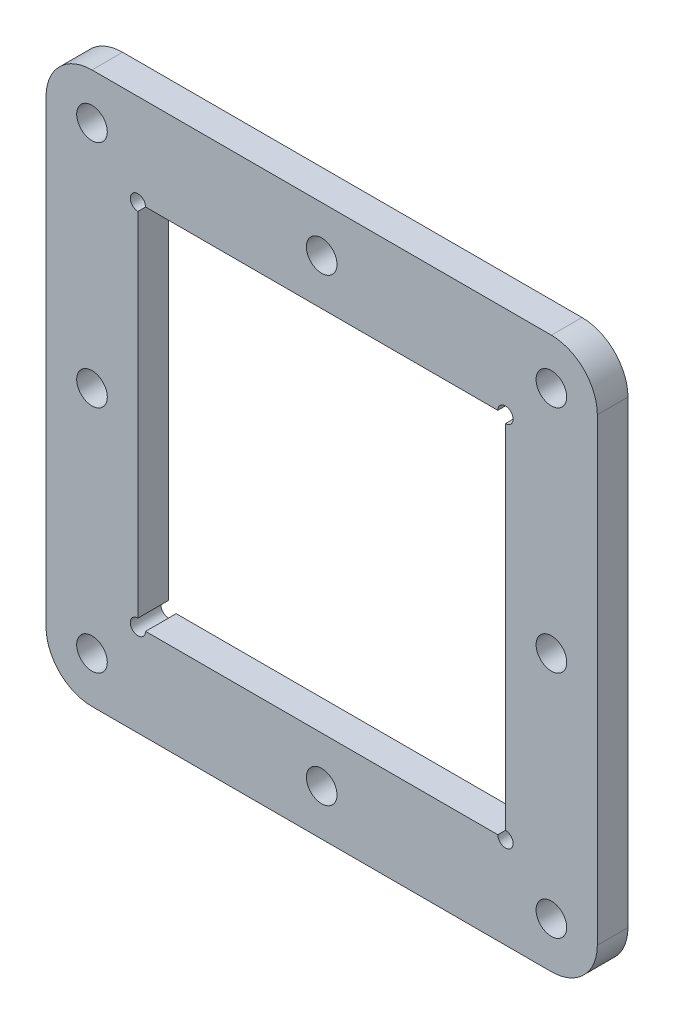
ISO-10303-21;
HEADER;
FILE_DESCRIPTION(('STEP AP214'),'2;1');
FILE_NAME('part.step','',(''),(''),'','','');
FILE_SCHEMA(('AUTOMOTIVE_DESIGN { 1 0 10303 214 1 1 1 1 }'));
ENDSEC;
DATA;
#1=APPLICATION_CONTEXT('core data for automotive mechanical design processes');
#2=APPLICATION_PROTOCOL_DEFINITION('international standard','automotive_design',2000,#1);
#3=PRODUCT_CONTEXT('',#1,'mechanical');
#4=PRODUCT('Part','Part','',(#3));
#5=PRODUCT_RELATED_PRODUCT_CATEGORY('part','',(#4));
#6=PRODUCT_DEFINITION_FORMATION('','',#4);
#7=PRODUCT_DEFINITION_CONTEXT('part definition',#1,'design');
#8=PRODUCT_DEFINITION('design','',#6,#7);
#9=PRODUCT_DEFINITION_SHAPE('','',#8);
#10=(LENGTH_UNIT() NAMED_UNIT(*) SI_UNIT(.MILLI.,.METRE.));
#11=(NAMED_UNIT(*) PLANE_ANGLE_UNIT() SI_UNIT($,.RADIAN.));
#12=(NAMED_UNIT(*) SI_UNIT($,.STERADIAN.) SOLID_ANGLE_UNIT());
#13=UNCERTAINTY_MEASURE_WITH_UNIT(LENGTH_MEASURE(1.E-05),#10,'distance_accuracy_value','');
#14=(GEOMETRIC_REPRESENTATION_CONTEXT(3) GLOBAL_UNCERTAINTY_ASSIGNED_CONTEXT((#13)) GLOBAL_UNIT_ASSIGNED_CONTEXT((#10,
#11,#12)) REPRESENTATION_CONTEXT('',''));
#15=CARTESIAN_POINT('',(0.,0.,0.));
#16=DIRECTION('',(0.,0.,1.));
#17=DIRECTION('',(1.,0.,0.));
#18=AXIS2_PLACEMENT_3D('',#15,#16,#17);
#19=CARTESIAN_POINT('',(-75.,-75.,10.));
#20=DIRECTION('',(0.,0.,1.));
#21=DIRECTION('',(1.,0.,0.));
#22=AXIS2_PLACEMENT_3D('',#19,#20,#21);
#23=PLANE('',#22);
#24=CARTESIAN_POINT('',(-60.,-60.,10.));
#25=DIRECTION('',(0.,0.,1.));
#26=DIRECTION('',(1.,0.,0.));
#27=AXIS2_PLACEMENT_3D('',#24,#25,#26);
#28=CIRCLE('',#27,2.5);
#29=CARTESIAN_POINT('',(-60.,-57.5,10.));
#30=VERTEX_POINT('',#29);
#31=CARTESIAN_POINT('',(-57.5,-60.,10.));
#32=VERTEX_POINT('',#31);
#33=EDGE_CURVE('E495',#30,#32,#28,.T.);
#34=ORIENTED_EDGE('',*,*,#33,.F.);
#35=DIRECTION('',(0.,-1.,0.));
#36=VECTOR('',#35,1.);
#37=CARTESIAN_POINT('',(-60.,60.,10.));
#38=LINE('',#37,#36);
#39=CARTESIAN_POINT('',(-60.,57.5,10.));
#40=VERTEX_POINT('',#39);
#41=EDGE_CURVE('E178',#40,#30,#38,.T.);
#42=ORIENTED_EDGE('',*,*,#41,.F.);
#43=CARTESIAN_POINT('',(-60.,60.,10.));
#44=DIRECTION('',(0.,0.,1.));
#45=DIRECTION('',(1.,0.,0.));
#46=AXIS2_PLACEMENT_3D('',#43,#44,#45);
#47=CIRCLE('',#46,2.5);
#48=CARTESIAN_POINT('',(-57.5,60.,10.));
#49=VERTEX_POINT('',#48);
#50=EDGE_CURVE('E57',#49,#40,#47,.T.);
#51=ORIENTED_EDGE('',*,*,#50,.F.);
#52=DIRECTION('',(-1.,0.,0.));
#53=VECTOR('',#52,1.);
#54=CARTESIAN_POINT('',(-60.,60.,10.));
#55=LINE('',#54,#53);
#56=CARTESIAN_POINT('',(57.5,60.,10.));
#57=VERTEX_POINT('',#56);
#58=EDGE_CURVE('E174',#57,#49,#55,.T.);
#59=ORIENTED_EDGE('',*,*,#58,.F.);
#60=CARTESIAN_POINT('',(60.,60.,10.));
#61=DIRECTION('',(0.,0.,1.));
#62=DIRECTION('',(1.,0.,0.));
#63=AXIS2_PLACEMENT_3D('',#60,#61,#62);
#64=CIRCLE('',#63,2.5);
#65=CARTESIAN_POINT('',(60.,57.5,10.));
#66=VERTEX_POINT('',#65);
#67=EDGE_CURVE('E49',#66,#57,#64,.T.);
#68=ORIENTED_EDGE('',*,*,#67,.F.);
#69=DIRECTION('',(0.,1.,0.));
#70=VECTOR('',#69,1.);
#71=CARTESIAN_POINT('',(60.,60.,10.));
#72=LINE('',#71,#70);
#73=CARTESIAN_POINT('',(60.,-57.5,10.));
#74=VERTEX_POINT('',#73);
#75=EDGE_CURVE('E165',#74,#66,#72,.T.);
#76=ORIENTED_EDGE('',*,*,#75,.F.);
#77=CARTESIAN_POINT('',(60.,-60.,10.));
#78=DIRECTION('',(0.,0.,1.));
#79=DIRECTION('',(1.,0.,0.));
#80=AXIS2_PLACEMENT_3D('',#77,#78,#79);
#81=CIRCLE('',#80,2.5);
#82=CARTESIAN_POINT('',(57.5,-60.,10.));
#83=VERTEX_POINT('',#82);
#84=EDGE_CURVE('E146',#83,#74,#81,.T.);
#85=ORIENTED_EDGE('',*,*,#84,.F.);
#86=DIRECTION('',(1.,0.,0.));
#87=VECTOR('',#86,1.);
#88=CARTESIAN_POINT('',(-60.,-60.,10.));
#89=LINE('',#88,#87);
#90=EDGE_CURVE('E189',#32,#83,#89,.T.);
#91=ORIENTED_EDGE('',*,*,#90,.F.);
#92=EDGE_LOOP('',(#34,#42,#51,#59,#68,#76,#85,#91));
#93=FACE_BOUND('',#92,.T.);
#94=CARTESIAN_POINT('',(1.54341102686378E-12,-75.,10.));
#95=DIRECTION('',(0.,0.,1.));
#96=DIRECTION('',(1.,0.,0.));
#97=AXIS2_PLACEMENT_3D('',#94,#95,#96);
#98=CIRCLE('',#97,5.);
#99=CARTESIAN_POINT('',(5.00000000000154,-75.,10.));
#100=VERTEX_POINT('',#99);
#101=EDGE_CURVE('E306',#100,#100,#98,.T.);
#102=ORIENTED_EDGE('',*,*,#101,.F.);
#103=EDGE_LOOP('',(#102));
#104=FACE_BOUND('',#103,.T.);
#105=CARTESIAN_POINT('',(75.0000000000008,0.,10.));
#106=DIRECTION('',(0.,0.,1.));
#107=DIRECTION('',(1.,0.,0.));
#108=AXIS2_PLACEMENT_3D('',#105,#106,#107);
#109=CIRCLE('',#108,5.);
#110=CARTESIAN_POINT('',(80.0000000000008,0.,10.));
#111=VERTEX_POINT('',#110);
#112=EDGE_CURVE('E318',#111,#111,#109,.T.);
#113=ORIENTED_EDGE('',*,*,#112,.F.);
#114=EDGE_LOOP('',(#113));
#115=FACE_BOUND('',#114,.T.);
#116=CARTESIAN_POINT('',(75.,75.,10.));
#117=DIRECTION('',(0.,0.,1.));
#118=DIRECTION('',(1.,0.,0.));
#119=AXIS2_PLACEMENT_3D('',#116,#117,#118);
#120=CIRCLE('',#119,5.00000000000001);
#121=CARTESIAN_POINT('',(80.,75.,10.));
#122=VERTEX_POINT('',#121);
#123=EDGE_CURVE('E199',#122,#122,#120,.T.);
#124=ORIENTED_EDGE('',*,*,#123,.F.);
#125=EDGE_LOOP('',(#124));
#126=FACE_BOUND('',#125,.T.);
#127=CARTESIAN_POINT('',(-75.,75.,10.));
#128=DIRECTION('',(0.,0.,1.));
#129=DIRECTION('',(1.,0.,0.));
#130=AXIS2_PLACEMENT_3D('',#127,#128,#129);
#131=CIRCLE('',#130,5.00000000000001);
#132=CARTESIAN_POINT('',(-70.,75.,10.));
#133=VERTEX_POINT('',#132);
#134=EDGE_CURVE('E211',#133,#133,#131,.T.);
#135=ORIENTED_EDGE('',*,*,#134,.F.);
#136=EDGE_LOOP('',(#135));
#137=FACE_BOUND('',#136,.T.);
#138=CARTESIAN_POINT('',(-75.,-75.,10.));
#139=DIRECTION('',(0.,0.,1.));
#140=DIRECTION('',(1.,0.,0.));
#141=AXIS2_PLACEMENT_3D('',#138,#139,#140);
#142=CIRCLE('',#141,15.);
#143=CARTESIAN_POINT('',(-90.,-74.9999999999999,10.));
#144=VERTEX_POINT('',#143);
#145=CARTESIAN_POINT('',(-74.9999999999999,-90.,10.));
#146=VERTEX_POINT('',#145);
#147=EDGE_CURVE('E217',#144,#146,#142,.T.);
#148=ORIENTED_EDGE('',*,*,#147,.T.);
#149=DIRECTION('',(1.,0.,0.));
#150=VECTOR('',#149,1.);
#151=CARTESIAN_POINT('',(-74.9999999999999,-90.,10.));
#152=LINE('',#151,#150);
#153=CARTESIAN_POINT('',(75.0000000000032,-89.9999999999992,10.));
#154=VERTEX_POINT('',#153);
#155=EDGE_CURVE('E220',#146,#154,#152,.T.);
#156=ORIENTED_EDGE('',*,*,#155,.T.);
#157=CARTESIAN_POINT('',(75.0000000000032,-74.9999999999992,10.));
#158=DIRECTION('',(0.,0.,1.));
#159=DIRECTION('',(1.,0.,0.));
#160=AXIS2_PLACEMENT_3D('',#157,#158,#159);
#161=CIRCLE('',#160,15.);
#162=CARTESIAN_POINT('',(90.0000000000032,-74.9999999999981,10.));
#163=VERTEX_POINT('',#162);
#164=EDGE_CURVE('E223',#154,#163,#161,.T.);
#165=ORIENTED_EDGE('',*,*,#164,.T.);
#166=DIRECTION('',(0.,1.,0.));
#167=VECTOR('',#166,1.);
#168=CARTESIAN_POINT('',(90.,75.0000000000019,10.));
#169=LINE('',#168,#167);
#170=CARTESIAN_POINT('',(90.,75.0000000000019,10.));
#171=VERTEX_POINT('',#170);
#172=EDGE_CURVE('E225',#163,#171,#169,.T.);
#173=ORIENTED_EDGE('',*,*,#172,.T.);
#174=CARTESIAN_POINT('',(75.,75.,10.));
#175=DIRECTION('',(0.,0.,1.));
#176=DIRECTION('',(-1.,0.,0.));
#177=AXIS2_PLACEMENT_3D('',#174,#175,#176);
#178=CIRCLE('',#177,15.);
#179=CARTESIAN_POINT('',(74.9999999999999,90.,10.));
#180=VERTEX_POINT('',#179);
#181=EDGE_CURVE('E227',#171,#180,#178,.T.);
#182=ORIENTED_EDGE('',*,*,#181,.T.);
#183=DIRECTION('',(-1.,0.,0.));
#184=VECTOR('',#183,1.);
#185=CARTESIAN_POINT('',(-74.9999999999999,90.,10.));
#186=LINE('',#185,#184);
#187=CARTESIAN_POINT('',(-74.9999999999999,90.,10.));
#188=VERTEX_POINT('',#187);
#189=EDGE_CURVE('E229',#180,#188,#186,.T.);
#190=ORIENTED_EDGE('',*,*,#189,.T.);
#191=CARTESIAN_POINT('',(-75.,75.,10.));
#192=DIRECTION('',(0.,0.,1.));
#193=DIRECTION('',(1.,0.,0.));
#194=AXIS2_PLACEMENT_3D('',#191,#192,#193);
#195=CIRCLE('',#194,15.);
#196=CARTESIAN_POINT('',(-90.,74.9999999999999,10.));
#197=VERTEX_POINT('',#196);
#198=EDGE_CURVE('E231',#188,#197,#195,.T.);
#199=ORIENTED_EDGE('',*,*,#198,.T.);
#200=DIRECTION('',(0.,-1.,0.));
#201=VECTOR('',#200,1.);
#202=CARTESIAN_POINT('',(-90.,74.9999999999999,10.));
#203=LINE('',#202,#201);
#204=EDGE_CURVE('E233',#197,#144,#203,.T.);
#205=ORIENTED_EDGE('',*,*,#204,.T.);
#206=EDGE_LOOP('',(#148,#156,#165,#173,#182,#190,#199,#205));
#207=FACE_BOUND('',#206,.T.);
#208=CARTESIAN_POINT('',(0.,75.,10.));
#209=DIRECTION('',(0.,0.,1.));
#210=DIRECTION('',(1.,0.,0.));
#211=AXIS2_PLACEMENT_3D('',#208,#209,#210);
#212=CIRCLE('',#211,5.);
#213=CARTESIAN_POINT('',(4.99999999999997,75.,10.));
#214=VERTEX_POINT('',#213);
#215=EDGE_CURVE('E205',#214,#214,#212,.T.);
#216=ORIENTED_EDGE('',*,*,#215,.F.);
#217=EDGE_LOOP('',(#216));
#218=FACE_BOUND('',#217,.T.);
#219=CARTESIAN_POINT('',(-74.9999999999992,0.,10.));
#220=DIRECTION('',(0.,0.,1.));
#221=DIRECTION('',(1.,0.,0.));
#222=AXIS2_PLACEMENT_3D('',#219,#220,#221);
#223=CIRCLE('',#222,5.);
#224=CARTESIAN_POINT('',(-69.9999999999992,0.,10.));
#225=VERTEX_POINT('',#224);
#226=EDGE_CURVE('E194',#225,#225,#223,.T.);
#227=ORIENTED_EDGE('',*,*,#226,.F.);
#228=EDGE_LOOP('',(#227));
#229=FACE_BOUND('',#228,.T.);
#230=CARTESIAN_POINT('',(-74.9999999999985,-75.,10.));
#231=DIRECTION('',(0.,0.,1.));
#232=DIRECTION('',(1.,0.,0.));
#233=AXIS2_PLACEMENT_3D('',#230,#231,#232);
#234=CIRCLE('',#233,5.00000000000001);
#235=CARTESIAN_POINT('',(-69.9999999999985,-75.,10.));
#236=VERTEX_POINT('',#235);
#237=EDGE_CURVE('E312',#236,#236,#234,.T.);
#238=ORIENTED_EDGE('',*,*,#237,.F.);
#239=EDGE_LOOP('',(#238));
#240=FACE_BOUND('',#239,.T.);
#241=CARTESIAN_POINT('',(75.0000000000015,-75.,10.));
#242=DIRECTION('',(0.,0.,1.));
#243=DIRECTION('',(1.,0.,0.));
#244=AXIS2_PLACEMENT_3D('',#241,#242,#243);
#245=CIRCLE('',#244,5.00000000000001);
#246=CARTESIAN_POINT('',(80.0000000000015,-75.,10.));
#247=VERTEX_POINT('',#246);
#248=EDGE_CURVE('E300',#247,#247,#245,.T.);
#249=ORIENTED_EDGE('',*,*,#248,.F.);
#250=EDGE_LOOP('',(#249));
#251=FACE_BOUND('',#250,.T.);
#252=ADVANCED_FACE('F35',(#93,#104,#115,#126,#137,#207,#218,#229,#240,#251),#23,.T.);
#253=CARTESIAN_POINT('',(-75.,-75.,0.));
#254=DIRECTION('',(0.,0.,1.));
#255=DIRECTION('',(1.,0.,0.));
#256=AXIS2_PLACEMENT_3D('',#253,#254,#255);
#257=PLANE('',#256);
#258=CARTESIAN_POINT('',(75.,75.,0.));
#259=DIRECTION('',(0.,0.,1.));
#260=DIRECTION('',(1.,0.,0.));
#261=AXIS2_PLACEMENT_3D('',#258,#259,#260);
#262=CIRCLE('',#261,5.00000000000001);
#263=CARTESIAN_POINT('',(80.,75.,0.));
#264=VERTEX_POINT('',#263);
#265=EDGE_CURVE('E191',#264,#264,#262,.T.);
#266=ORIENTED_EDGE('',*,*,#265,.T.);
#267=EDGE_LOOP('',(#266));
#268=FACE_BOUND('',#267,.T.);
#269=CARTESIAN_POINT('',(0.,75.,0.));
#270=DIRECTION('',(0.,0.,1.));
#271=DIRECTION('',(1.,0.,0.));
#272=AXIS2_PLACEMENT_3D('',#269,#270,#271);
#273=CIRCLE('',#272,5.);
#274=CARTESIAN_POINT('',(4.99999999999997,75.,0.));
#275=VERTEX_POINT('',#274);
#276=EDGE_CURVE('E202',#275,#275,#273,.T.);
#277=ORIENTED_EDGE('',*,*,#276,.T.);
#278=EDGE_LOOP('',(#277));
#279=FACE_BOUND('',#278,.T.);
#280=CARTESIAN_POINT('',(-75.,75.,0.));
#281=DIRECTION('',(0.,0.,1.));
#282=DIRECTION('',(1.,0.,0.));
#283=AXIS2_PLACEMENT_3D('',#280,#281,#282);
#284=CIRCLE('',#283,5.00000000000001);
#285=CARTESIAN_POINT('',(-70.,75.,0.));
#286=VERTEX_POINT('',#285);
#287=EDGE_CURVE('E208',#286,#286,#284,.T.);
#288=ORIENTED_EDGE('',*,*,#287,.T.);
#289=EDGE_LOOP('',(#288));
#290=FACE_BOUND('',#289,.T.);
#291=CARTESIAN_POINT('',(-75.,-75.,0.));
#292=DIRECTION('',(0.,0.,1.));
#293=DIRECTION('',(1.,0.,0.));
#294=AXIS2_PLACEMENT_3D('',#291,#292,#293);
#295=CIRCLE('',#294,15.);
#296=CARTESIAN_POINT('',(-90.,-74.9999999999999,0.));
#297=VERTEX_POINT('',#296);
#298=CARTESIAN_POINT('',(-74.9999999999999,-90.,0.));
#299=VERTEX_POINT('',#298);
#300=EDGE_CURVE('E214',#297,#299,#295,.T.);
#301=ORIENTED_EDGE('',*,*,#300,.F.);
#302=DIRECTION('',(0.,-1.,0.));
#303=VECTOR('',#302,1.);
#304=CARTESIAN_POINT('',(-90.,74.9999999999999,0.));
#305=LINE('',#304,#303);
#306=CARTESIAN_POINT('',(-90.,74.9999999999999,0.));
#307=VERTEX_POINT('',#306);
#308=EDGE_CURVE('E221',#307,#297,#305,.T.);
#309=ORIENTED_EDGE('',*,*,#308,.F.);
#310=CARTESIAN_POINT('',(-75.,75.,0.));
#311=DIRECTION('',(0.,0.,1.));
#312=DIRECTION('',(1.,0.,0.));
#313=AXIS2_PLACEMENT_3D('',#310,#311,#312);
#314=CIRCLE('',#313,15.);
#315=CARTESIAN_POINT('',(-74.9999999999999,90.,0.));
#316=VERTEX_POINT('',#315);
#317=EDGE_CURVE('E248',#316,#307,#314,.T.);
#318=ORIENTED_EDGE('',*,*,#317,.F.);
#319=DIRECTION('',(-1.,0.,0.));
#320=VECTOR('',#319,1.);
#321=CARTESIAN_POINT('',(-74.9999999999999,90.,0.));
#322=LINE('',#321,#320);
#323=CARTESIAN_POINT('',(74.9999999999999,90.,0.));
#324=VERTEX_POINT('',#323);
#325=EDGE_CURVE('E246',#324,#316,#322,.T.);
#326=ORIENTED_EDGE('',*,*,#325,.F.);
#327=CARTESIAN_POINT('',(75.,75.,0.));
#328=DIRECTION('',(0.,0.,1.));
#329=DIRECTION('',(-1.,0.,0.));
#330=AXIS2_PLACEMENT_3D('',#327,#328,#329);
#331=CIRCLE('',#330,15.);
#332=CARTESIAN_POINT('',(90.,75.0000000000019,0.));
#333=VERTEX_POINT('',#332);
#334=EDGE_CURVE('E244',#333,#324,#331,.T.);
#335=ORIENTED_EDGE('',*,*,#334,.F.);
#336=DIRECTION('',(0.,1.,0.));
#337=VECTOR('',#336,1.);
#338=CARTESIAN_POINT('',(90.,75.0000000000019,0.));
#339=LINE('',#338,#337);
#340=CARTESIAN_POINT('',(90.0000000000032,-74.9999999999981,0.));
#341=VERTEX_POINT('',#340);
#342=EDGE_CURVE('E242',#341,#333,#339,.T.);
#343=ORIENTED_EDGE('',*,*,#342,.F.);
#344=CARTESIAN_POINT('',(75.0000000000032,-74.9999999999992,0.));
#345=DIRECTION('',(0.,0.,1.));
#346=DIRECTION('',(1.,0.,0.));
#347=AXIS2_PLACEMENT_3D('',#344,#345,#346);
#348=CIRCLE('',#347,15.);
#349=CARTESIAN_POINT('',(75.0000000000032,-89.9999999999992,0.));
#350=VERTEX_POINT('',#349);
#351=EDGE_CURVE('E240',#350,#341,#348,.T.);
#352=ORIENTED_EDGE('',*,*,#351,.F.);
#353=DIRECTION('',(1.,0.,0.));
#354=VECTOR('',#353,1.);
#355=CARTESIAN_POINT('',(-74.9999999999999,-90.,0.));
#356=LINE('',#355,#354);
#357=EDGE_CURVE('E238',#299,#350,#356,.T.);
#358=ORIENTED_EDGE('',*,*,#357,.F.);
#359=EDGE_LOOP('',(#301,#309,#318,#326,#335,#343,#352,#358));
#360=FACE_BOUND('',#359,.T.);
#361=DIRECTION('',(0.,-1.,0.));
#362=VECTOR('',#361,1.);
#363=CARTESIAN_POINT('',(-60.,60.,0.));
#364=LINE('',#363,#362);
#365=CARTESIAN_POINT('',(-60.,57.5,0.));
#366=VERTEX_POINT('',#365);
#367=CARTESIAN_POINT('',(-60.,-57.5,0.));
#368=VERTEX_POINT('',#367);
#369=EDGE_CURVE('E181',#366,#368,#364,.T.);
#370=ORIENTED_EDGE('',*,*,#369,.T.);
#371=CARTESIAN_POINT('',(-60.,-60.,0.));
#372=DIRECTION('',(0.,0.,1.));
#373=DIRECTION('',(1.,0.,0.));
#374=AXIS2_PLACEMENT_3D('',#371,#372,#373);
#375=CIRCLE('',#374,2.5);
#376=CARTESIAN_POINT('',(-57.5,-60.,0.));
#377=VERTEX_POINT('',#376);
#378=EDGE_CURVE('E158',#368,#377,#375,.T.);
#379=ORIENTED_EDGE('',*,*,#378,.T.);
#380=DIRECTION('',(1.,0.,0.));
#381=VECTOR('',#380,1.);
#382=CARTESIAN_POINT('',(-60.,-60.,0.));
#383=LINE('',#382,#381);
#384=CARTESIAN_POINT('',(57.5,-60.,0.));
#385=VERTEX_POINT('',#384);
#386=EDGE_CURVE('E175',#377,#385,#383,.T.);
#387=ORIENTED_EDGE('',*,*,#386,.T.);
#388=CARTESIAN_POINT('',(60.,-60.,0.));
#389=DIRECTION('',(0.,0.,1.));
#390=DIRECTION('',(1.,0.,0.));
#391=AXIS2_PLACEMENT_3D('',#388,#389,#390);
#392=CIRCLE('',#391,2.5);
#393=CARTESIAN_POINT('',(60.,-57.5,0.));
#394=VERTEX_POINT('',#393);
#395=EDGE_CURVE('E157',#385,#394,#392,.T.);
#396=ORIENTED_EDGE('',*,*,#395,.T.);
#397=DIRECTION('',(0.,1.,0.));
#398=VECTOR('',#397,1.);
#399=CARTESIAN_POINT('',(60.,60.,0.));
#400=LINE('',#399,#398);
#401=CARTESIAN_POINT('',(60.,57.5,0.));
#402=VERTEX_POINT('',#401);
#403=EDGE_CURVE('E167',#394,#402,#400,.T.);
#404=ORIENTED_EDGE('',*,*,#403,.T.);
#405=CARTESIAN_POINT('',(60.,60.,0.));
#406=DIRECTION('',(0.,0.,1.));
#407=DIRECTION('',(1.,0.,0.));
#408=AXIS2_PLACEMENT_3D('',#405,#406,#407);
#409=CIRCLE('',#408,2.5);
#410=CARTESIAN_POINT('',(57.5,60.,0.));
#411=VERTEX_POINT('',#410);
#412=EDGE_CURVE('E488',#402,#411,#409,.T.);
#413=ORIENTED_EDGE('',*,*,#412,.T.);
#414=DIRECTION('',(-1.,0.,0.));
#415=VECTOR('',#414,1.);
#416=CARTESIAN_POINT('',(-60.,60.,0.));
#417=LINE('',#416,#415);
#418=CARTESIAN_POINT('',(-57.5,60.,0.));
#419=VERTEX_POINT('',#418);
#420=EDGE_CURVE('E193',#411,#419,#417,.T.);
#421=ORIENTED_EDGE('',*,*,#420,.T.);
#422=CARTESIAN_POINT('',(-60.,60.,0.));
#423=DIRECTION('',(0.,0.,1.));
#424=DIRECTION('',(1.,0.,0.));
#425=AXIS2_PLACEMENT_3D('',#422,#423,#424);
#426=CIRCLE('',#425,2.5);
#427=EDGE_CURVE('E169',#419,#366,#426,.T.);
#428=ORIENTED_EDGE('',*,*,#427,.T.);
#429=EDGE_LOOP('',(#370,#379,#387,#396,#404,#413,#421,#428));
#430=FACE_BOUND('',#429,.T.);
#431=CARTESIAN_POINT('',(-74.9999999999992,0.,0.));
#432=DIRECTION('',(0.,0.,1.));
#433=DIRECTION('',(1.,0.,0.));
#434=AXIS2_PLACEMENT_3D('',#431,#432,#433);
#435=CIRCLE('',#434,5.);
#436=CARTESIAN_POINT('',(-69.9999999999992,0.,0.));
#437=VERTEX_POINT('',#436);
#438=EDGE_CURVE('E184',#437,#437,#435,.T.);
#439=ORIENTED_EDGE('',*,*,#438,.T.);
#440=EDGE_LOOP('',(#439));
#441=FACE_BOUND('',#440,.T.);
#442=CARTESIAN_POINT('',(75.0000000000008,0.,0.));
#443=DIRECTION('',(0.,0.,1.));
#444=DIRECTION('',(1.,0.,0.));
#445=AXIS2_PLACEMENT_3D('',#442,#443,#444);
#446=CIRCLE('',#445,5.);
#447=CARTESIAN_POINT('',(80.0000000000008,0.,0.));
#448=VERTEX_POINT('',#447);
#449=EDGE_CURVE('E315',#448,#448,#446,.T.);
#450=ORIENTED_EDGE('',*,*,#449,.T.);
#451=EDGE_LOOP('',(#450));
#452=FACE_BOUND('',#451,.T.);
#453=CARTESIAN_POINT('',(-74.9999999999985,-75.,0.));
#454=DIRECTION('',(0.,0.,1.));
#455=DIRECTION('',(1.,0.,0.));
#456=AXIS2_PLACEMENT_3D('',#453,#454,#455);
#457=CIRCLE('',#456,5.00000000000001);
#458=CARTESIAN_POINT('',(-69.9999999999985,-75.,0.));
#459=VERTEX_POINT('',#458);
#460=EDGE_CURVE('E309',#459,#459,#457,.T.);
#461=ORIENTED_EDGE('',*,*,#460,.T.);
#462=EDGE_LOOP('',(#461));
#463=FACE_BOUND('',#462,.T.);
#464=CARTESIAN_POINT('',(1.54341102686378E-12,-75.,0.));
#465=DIRECTION('',(0.,0.,1.));
#466=DIRECTION('',(1.,0.,0.));
#467=AXIS2_PLACEMENT_3D('',#464,#465,#466);
#468=CIRCLE('',#467,5.);
#469=CARTESIAN_POINT('',(5.00000000000154,-75.,0.));
#470=VERTEX_POINT('',#469);
#471=EDGE_CURVE('E303',#470,#470,#468,.T.);
#472=ORIENTED_EDGE('',*,*,#471,.T.);
#473=EDGE_LOOP('',(#472));
#474=FACE_BOUND('',#473,.T.);
#475=CARTESIAN_POINT('',(75.0000000000015,-75.,0.));
#476=DIRECTION('',(0.,0.,1.));
#477=DIRECTION('',(1.,0.,0.));
#478=AXIS2_PLACEMENT_3D('',#475,#476,#477);
#479=CIRCLE('',#478,5.00000000000001);
#480=CARTESIAN_POINT('',(80.0000000000015,-75.,0.));
#481=VERTEX_POINT('',#480);
#482=EDGE_CURVE('E299',#481,#481,#479,.T.);
#483=ORIENTED_EDGE('',*,*,#482,.T.);
#484=EDGE_LOOP('',(#483));
#485=FACE_BOUND('',#484,.T.);
#486=ADVANCED_FACE('F283',(#268,#279,#290,#360,#430,#441,#452,#463,#474,#485),#257,.F.);
#487=CARTESIAN_POINT('',(-75.,-75.,10.));
#488=DIRECTION('',(0.,0.,-1.));
#489=DIRECTION('',(-1.,0.,0.));
#490=AXIS2_PLACEMENT_3D('',#487,#488,#489);
#491=CYLINDRICAL_SURFACE('',#490,15.);
#492=ORIENTED_EDGE('',*,*,#300,.T.);
#493=DIRECTION('',(0.,0.,-1.));
#494=VECTOR('',#493,1.);
#495=CARTESIAN_POINT('',(-74.9999999999999,-90.,10.));
#496=LINE('',#495,#494);
#497=EDGE_CURVE('E271',#146,#299,#496,.T.);
#498=ORIENTED_EDGE('',*,*,#497,.F.);
#499=ORIENTED_EDGE('',*,*,#147,.F.);
#500=DIRECTION('',(0.,0.,-1.));
#501=VECTOR('',#500,1.);
#502=CARTESIAN_POINT('',(-90.,-74.9999999999999,10.));
#503=LINE('',#502,#501);
#504=EDGE_CURVE('E235',#144,#297,#503,.T.);
#505=ORIENTED_EDGE('',*,*,#504,.T.);
#506=EDGE_LOOP('',(#492,#498,#499,#505));
#507=FACE_BOUND('',#506,.T.);
#508=ADVANCED_FACE('F37',(#507),#491,.T.);
#509=CARTESIAN_POINT('',(-74.9999999999999,-90.,10.));
#510=DIRECTION('',(0.,1.,0.));
#511=DIRECTION('',(-1.,0.,0.));
#512=AXIS2_PLACEMENT_3D('',#509,#510,#511);
#513=PLANE('',#512);
#514=ORIENTED_EDGE('',*,*,#357,.T.);
#515=DIRECTION('',(0.,0.,-1.));
#516=VECTOR('',#515,1.);
#517=CARTESIAN_POINT('',(75.0000000000032,-89.9999999999992,10.));
#518=LINE('',#517,#516);
#519=EDGE_CURVE('E268',#154,#350,#518,.T.);
#520=ORIENTED_EDGE('',*,*,#519,.F.);
#521=ORIENTED_EDGE('',*,*,#155,.F.);
#522=ORIENTED_EDGE('',*,*,#497,.T.);
#523=EDGE_LOOP('',(#514,#520,#521,#522));
#524=FACE_BOUND('',#523,.T.);
#525=ADVANCED_FACE('F378',(#524),#513,.F.);
#526=CARTESIAN_POINT('',(75.0000000000032,-74.9999999999992,10.));
#527=DIRECTION('',(0.,0.,-1.));
#528=DIRECTION('',(-1.,0.,0.));
#529=AXIS2_PLACEMENT_3D('',#526,#527,#528);
#530=CYLINDRICAL_SURFACE('',#529,15.);
#531=ORIENTED_EDGE('',*,*,#351,.T.);
#532=DIRECTION('',(0.,0.,-1.));
#533=VECTOR('',#532,1.);
#534=CARTESIAN_POINT('',(90.0000000000032,-74.9999999999981,10.));
#535=LINE('',#534,#533);
#536=EDGE_CURVE('E265',#163,#341,#535,.T.);
#537=ORIENTED_EDGE('',*,*,#536,.F.);
#538=ORIENTED_EDGE('',*,*,#164,.F.);
#539=ORIENTED_EDGE('',*,*,#519,.T.);
#540=EDGE_LOOP('',(#531,#537,#538,#539));
#541=FACE_BOUND('',#540,.T.);
#542=ADVANCED_FACE('F375',(#541),#530,.T.);
#543=CARTESIAN_POINT('',(90.,75.0000000000019,10.));
#544=DIRECTION('',(-1.,0.,0.));
#545=DIRECTION('',(0.,-1.,0.));
#546=AXIS2_PLACEMENT_3D('',#543,#544,#545);
#547=PLANE('',#546);
#548=ORIENTED_EDGE('',*,*,#342,.T.);
#549=DIRECTION('',(0.,0.,-1.));
#550=VECTOR('',#549,1.);
#551=CARTESIAN_POINT('',(90.,75.0000000000019,10.));
#552=LINE('',#551,#550);
#553=EDGE_CURVE('E262',#171,#333,#552,.T.);
#554=ORIENTED_EDGE('',*,*,#553,.F.);
#555=ORIENTED_EDGE('',*,*,#172,.F.);
#556=ORIENTED_EDGE('',*,*,#536,.T.);
#557=EDGE_LOOP('',(#548,#554,#555,#556));
#558=FACE_BOUND('',#557,.T.);
#559=ADVANCED_FACE('F371',(#558),#547,.F.);
#560=CARTESIAN_POINT('',(75.,75.,10.));
#561=DIRECTION('',(0.,0.,-1.));
#562=DIRECTION('',(-1.,0.,0.));
#563=AXIS2_PLACEMENT_3D('',#560,#561,#562);
#564=CYLINDRICAL_SURFACE('',#563,15.);
#565=ORIENTED_EDGE('',*,*,#334,.T.);
#566=DIRECTION('',(0.,0.,-1.));
#567=VECTOR('',#566,1.);
#568=CARTESIAN_POINT('',(74.9999999999999,90.,10.));
#569=LINE('',#568,#567);
#570=EDGE_CURVE('E259',#180,#324,#569,.T.);
#571=ORIENTED_EDGE('',*,*,#570,.F.);
#572=ORIENTED_EDGE('',*,*,#181,.F.);
#573=ORIENTED_EDGE('',*,*,#553,.T.);
#574=EDGE_LOOP('',(#565,#571,#572,#573));
#575=FACE_BOUND('',#574,.T.);
#576=ADVANCED_FACE('F367',(#575),#564,.T.);
#577=CARTESIAN_POINT('',(-74.9999999999999,90.,10.));
#578=DIRECTION('',(0.,-1.,0.));
#579=DIRECTION('',(0.,0.,-1.));
#580=AXIS2_PLACEMENT_3D('',#577,#578,#579);
#581=PLANE('',#580);
#582=ORIENTED_EDGE('',*,*,#325,.T.);
#583=DIRECTION('',(0.,0.,-1.));
#584=VECTOR('',#583,1.);
#585=CARTESIAN_POINT('',(-74.9999999999999,90.,10.));
#586=LINE('',#585,#584);
#587=EDGE_CURVE('E256',#188,#316,#586,.T.);
#588=ORIENTED_EDGE('',*,*,#587,.F.);
#589=ORIENTED_EDGE('',*,*,#189,.F.);
#590=ORIENTED_EDGE('',*,*,#570,.T.);
#591=EDGE_LOOP('',(#582,#588,#589,#590));
#592=FACE_BOUND('',#591,.T.);
#593=ADVANCED_FACE('F363',(#592),#581,.F.);
#594=CARTESIAN_POINT('',(-75.,75.,10.));
#595=DIRECTION('',(0.,0.,-1.));
#596=DIRECTION('',(-1.,0.,0.));
#597=AXIS2_PLACEMENT_3D('',#594,#595,#596);
#598=CYLINDRICAL_SURFACE('',#597,15.);
#599=ORIENTED_EDGE('',*,*,#317,.T.);
#600=DIRECTION('',(0.,0.,-1.));
#601=VECTOR('',#600,1.);
#602=CARTESIAN_POINT('',(-90.,74.9999999999999,10.));
#603=LINE('',#602,#601);
#604=EDGE_CURVE('E253',#197,#307,#603,.T.);
#605=ORIENTED_EDGE('',*,*,#604,.F.);
#606=ORIENTED_EDGE('',*,*,#198,.F.);
#607=ORIENTED_EDGE('',*,*,#587,.T.);
#608=EDGE_LOOP('',(#599,#605,#606,#607));
#609=FACE_BOUND('',#608,.T.);
#610=ADVANCED_FACE('F359',(#609),#598,.T.);
#611=CARTESIAN_POINT('',(-90.,74.9999999999999,10.));
#612=DIRECTION('',(1.,0.,0.));
#613=DIRECTION('',(0.,1.,0.));
#614=AXIS2_PLACEMENT_3D('',#611,#612,#613);
#615=PLANE('',#614);
#616=ORIENTED_EDGE('',*,*,#308,.T.);
#617=ORIENTED_EDGE('',*,*,#504,.F.);
#618=ORIENTED_EDGE('',*,*,#204,.F.);
#619=ORIENTED_EDGE('',*,*,#604,.T.);
#620=EDGE_LOOP('',(#616,#617,#618,#619));
#621=FACE_BOUND('',#620,.T.);
#622=ADVANCED_FACE('F356',(#621),#615,.F.);
#623=CARTESIAN_POINT('',(-75.,75.,10.));
#624=DIRECTION('',(0.,0.,-1.));
#625=DIRECTION('',(-1.,0.,0.));
#626=AXIS2_PLACEMENT_3D('',#623,#624,#625);
#627=CYLINDRICAL_SURFACE('',#626,5.00000000000001);
#628=ORIENTED_EDGE('',*,*,#134,.T.);
#629=EDGE_LOOP('',(#628));
#630=FACE_BOUND('',#629,.T.);
#631=ORIENTED_EDGE('',*,*,#287,.F.);
#632=EDGE_LOOP('',(#631));
#633=FACE_BOUND('',#632,.T.);
#634=ADVANCED_FACE('F353',(#630,#633),#627,.F.);
#635=CARTESIAN_POINT('',(0.,75.,10.));
#636=DIRECTION('',(0.,0.,-1.));
#637=DIRECTION('',(-1.,0.,0.));
#638=AXIS2_PLACEMENT_3D('',#635,#636,#637);
#639=CYLINDRICAL_SURFACE('',#638,5.);
#640=ORIENTED_EDGE('',*,*,#215,.T.);
#641=EDGE_LOOP('',(#640));
#642=FACE_BOUND('',#641,.T.);
#643=ORIENTED_EDGE('',*,*,#276,.F.);
#644=EDGE_LOOP('',(#643));
#645=FACE_BOUND('',#644,.T.);
#646=ADVANCED_FACE('F510',(#642,#645),#639,.F.);
#647=CARTESIAN_POINT('',(75.,75.,10.));
#648=DIRECTION('',(0.,0.,-1.));
#649=DIRECTION('',(-1.,0.,0.));
#650=AXIS2_PLACEMENT_3D('',#647,#648,#649);
#651=CYLINDRICAL_SURFACE('',#650,5.00000000000001);
#652=ORIENTED_EDGE('',*,*,#123,.T.);
#653=EDGE_LOOP('',(#652));
#654=FACE_BOUND('',#653,.T.);
#655=ORIENTED_EDGE('',*,*,#265,.F.);
#656=EDGE_LOOP('',(#655));
#657=FACE_BOUND('',#656,.T.);
#658=ADVANCED_FACE('F506',(#654,#657),#651,.F.);
#659=CARTESIAN_POINT('',(60.,60.,10.));
#660=DIRECTION('',(-1.,0.,0.));
#661=DIRECTION('',(0.,-1.,0.));
#662=AXIS2_PLACEMENT_3D('',#659,#660,#661);
#663=PLANE('',#662);
#664=DIRECTION('',(0.,0.,1.));
#665=VECTOR('',#664,1.);
#666=CARTESIAN_POINT('',(60.,-57.5,0.));
#667=LINE('',#666,#665);
#668=EDGE_CURVE('E149',#74,#394,#667,.F.);
#669=ORIENTED_EDGE('',*,*,#668,.F.);
#670=ORIENTED_EDGE('',*,*,#75,.T.);
#671=DIRECTION('',(0.,0.,1.));
#672=VECTOR('',#671,1.);
#673=CARTESIAN_POINT('',(60.,57.5,0.));
#674=LINE('',#673,#672);
#675=EDGE_CURVE('E294',#402,#66,#674,.T.);
#676=ORIENTED_EDGE('',*,*,#675,.F.);
#677=ORIENTED_EDGE('',*,*,#403,.F.);
#678=EDGE_LOOP('',(#669,#670,#676,#677));
#679=FACE_BOUND('',#678,.T.);
#680=ADVANCED_FACE('F163',(#679),#663,.T.);
#681=CARTESIAN_POINT('',(-60.,60.,10.));
#682=DIRECTION('',(0.,-1.,0.));
#683=DIRECTION('',(1.,0.,0.));
#684=AXIS2_PLACEMENT_3D('',#681,#682,#683);
#685=PLANE('',#684);
#686=DIRECTION('',(0.,0.,1.));
#687=VECTOR('',#686,1.);
#688=CARTESIAN_POINT('',(57.5,60.,0.));
#689=LINE('',#688,#687);
#690=EDGE_CURVE('E11',#57,#411,#689,.F.);
#691=ORIENTED_EDGE('',*,*,#690,.F.);
#692=ORIENTED_EDGE('',*,*,#58,.T.);
#693=DIRECTION('',(0.,0.,1.));
#694=VECTOR('',#693,1.);
#695=CARTESIAN_POINT('',(-57.5,60.,0.));
#696=LINE('',#695,#694);
#697=EDGE_CURVE('E292',#419,#49,#696,.T.);
#698=ORIENTED_EDGE('',*,*,#697,.F.);
#699=ORIENTED_EDGE('',*,*,#420,.F.);
#700=EDGE_LOOP('',(#691,#692,#698,#699));
#701=FACE_BOUND('',#700,.T.);
#702=ADVANCED_FACE('F498',(#701),#685,.T.);
#703=CARTESIAN_POINT('',(-60.,60.,10.));
#704=DIRECTION('',(1.,0.,0.));
#705=DIRECTION('',(0.,1.,0.));
#706=AXIS2_PLACEMENT_3D('',#703,#704,#705);
#707=PLANE('',#706);
#708=DIRECTION('',(0.,0.,1.));
#709=VECTOR('',#708,1.);
#710=CARTESIAN_POINT('',(-60.,-57.5,0.));
#711=LINE('',#710,#709);
#712=EDGE_CURVE('E168',#368,#30,#711,.T.);
#713=ORIENTED_EDGE('',*,*,#712,.F.);
#714=ORIENTED_EDGE('',*,*,#369,.F.);
#715=DIRECTION('',(0.,0.,1.));
#716=VECTOR('',#715,1.);
#717=CARTESIAN_POINT('',(-60.,57.5,0.));
#718=LINE('',#717,#716);
#719=EDGE_CURVE('E43',#40,#366,#718,.F.);
#720=ORIENTED_EDGE('',*,*,#719,.F.);
#721=ORIENTED_EDGE('',*,*,#41,.T.);
#722=EDGE_LOOP('',(#713,#714,#720,#721));
#723=FACE_BOUND('',#722,.T.);
#724=ADVANCED_FACE('F290',(#723),#707,.T.);
#725=CARTESIAN_POINT('',(-60.,-60.,10.));
#726=DIRECTION('',(0.,1.,0.));
#727=DIRECTION('',(0.,0.,1.));
#728=AXIS2_PLACEMENT_3D('',#725,#726,#727);
#729=PLANE('',#728);
#730=DIRECTION('',(0.,0.,1.));
#731=VECTOR('',#730,1.);
#732=CARTESIAN_POINT('',(-57.5,-60.,0.));
#733=LINE('',#732,#731);
#734=EDGE_CURVE('E275',#32,#377,#733,.F.);
#735=ORIENTED_EDGE('',*,*,#734,.F.);
#736=ORIENTED_EDGE('',*,*,#90,.T.);
#737=DIRECTION('',(0.,0.,1.));
#738=VECTOR('',#737,1.);
#739=CARTESIAN_POINT('',(57.5,-60.,0.));
#740=LINE('',#739,#738);
#741=EDGE_CURVE('E152',#385,#83,#740,.T.);
#742=ORIENTED_EDGE('',*,*,#741,.F.);
#743=ORIENTED_EDGE('',*,*,#386,.F.);
#744=EDGE_LOOP('',(#735,#736,#742,#743));
#745=FACE_BOUND('',#744,.T.);
#746=ADVANCED_FACE('F332',(#745),#729,.T.);
#747=CARTESIAN_POINT('',(-74.9999999999992,0.,10.));
#748=DIRECTION('',(0.,0.,-1.));
#749=DIRECTION('',(-1.,0.,0.));
#750=AXIS2_PLACEMENT_3D('',#747,#748,#749);
#751=CYLINDRICAL_SURFACE('',#750,5.);
#752=ORIENTED_EDGE('',*,*,#226,.T.);
#753=EDGE_LOOP('',(#752));
#754=FACE_BOUND('',#753,.T.);
#755=ORIENTED_EDGE('',*,*,#438,.F.);
#756=EDGE_LOOP('',(#755));
#757=FACE_BOUND('',#756,.T.);
#758=ADVANCED_FACE('F329',(#754,#757),#751,.F.);
#759=CARTESIAN_POINT('',(75.0000000000008,0.,10.));
#760=DIRECTION('',(0.,0.,-1.));
#761=DIRECTION('',(-1.,0.,0.));
#762=AXIS2_PLACEMENT_3D('',#759,#760,#761);
#763=CYLINDRICAL_SURFACE('',#762,5.);
#764=ORIENTED_EDGE('',*,*,#112,.T.);
#765=EDGE_LOOP('',(#764));
#766=FACE_BOUND('',#765,.T.);
#767=ORIENTED_EDGE('',*,*,#449,.F.);
#768=EDGE_LOOP('',(#767));
#769=FACE_BOUND('',#768,.T.);
#770=ADVANCED_FACE('F331',(#766,#769),#763,.F.);
#771=CARTESIAN_POINT('',(-74.9999999999985,-75.,10.));
#772=DIRECTION('',(0.,0.,-1.));
#773=DIRECTION('',(-1.,0.,0.));
#774=AXIS2_PLACEMENT_3D('',#771,#772,#773);
#775=CYLINDRICAL_SURFACE('',#774,5.00000000000001);
#776=ORIENTED_EDGE('',*,*,#237,.T.);
#777=EDGE_LOOP('',(#776));
#778=FACE_BOUND('',#777,.T.);
#779=ORIENTED_EDGE('',*,*,#460,.F.);
#780=EDGE_LOOP('',(#779));
#781=FACE_BOUND('',#780,.T.);
#782=ADVANCED_FACE('F338',(#778,#781),#775,.F.);
#783=CARTESIAN_POINT('',(1.54341102686378E-12,-75.,10.));
#784=DIRECTION('',(0.,0.,-1.));
#785=DIRECTION('',(-1.,0.,0.));
#786=AXIS2_PLACEMENT_3D('',#783,#784,#785);
#787=CYLINDRICAL_SURFACE('',#786,5.);
#788=ORIENTED_EDGE('',*,*,#101,.T.);
#789=EDGE_LOOP('',(#788));
#790=FACE_BOUND('',#789,.T.);
#791=ORIENTED_EDGE('',*,*,#471,.F.);
#792=EDGE_LOOP('',(#791));
#793=FACE_BOUND('',#792,.T.);
#794=ADVANCED_FACE('F421',(#790,#793),#787,.F.);
#795=CARTESIAN_POINT('',(75.0000000000015,-75.,10.));
#796=DIRECTION('',(0.,0.,-1.));
#797=DIRECTION('',(-1.,0.,0.));
#798=AXIS2_PLACEMENT_3D('',#795,#796,#797);
#799=CYLINDRICAL_SURFACE('',#798,5.00000000000001);
#800=ORIENTED_EDGE('',*,*,#248,.T.);
#801=EDGE_LOOP('',(#800));
#802=FACE_BOUND('',#801,.T.);
#803=ORIENTED_EDGE('',*,*,#482,.F.);
#804=EDGE_LOOP('',(#803));
#805=FACE_BOUND('',#804,.T.);
#806=ADVANCED_FACE('F418',(#802,#805),#799,.F.);
#807=CARTESIAN_POINT('',(60.,-60.,0.));
#808=DIRECTION('',(0.,0.,1.));
#809=DIRECTION('',(1.,0.,0.));
#810=AXIS2_PLACEMENT_3D('',#807,#808,#809);
#811=CYLINDRICAL_SURFACE('',#810,2.5);
#812=ORIENTED_EDGE('',*,*,#668,.T.);
#813=ORIENTED_EDGE('',*,*,#395,.F.);
#814=ORIENTED_EDGE('',*,*,#741,.T.);
#815=ORIENTED_EDGE('',*,*,#84,.T.);
#816=EDGE_LOOP('',(#812,#813,#814,#815));
#817=FACE_BOUND('',#816,.T.);
#818=ADVANCED_FACE('F148',(#817),#811,.F.);
#819=CARTESIAN_POINT('',(-60.,-60.,0.));
#820=DIRECTION('',(0.,0.,1.));
#821=DIRECTION('',(1.,0.,0.));
#822=AXIS2_PLACEMENT_3D('',#819,#820,#821);
#823=CYLINDRICAL_SURFACE('',#822,2.5);
#824=ORIENTED_EDGE('',*,*,#712,.T.);
#825=ORIENTED_EDGE('',*,*,#33,.T.);
#826=ORIENTED_EDGE('',*,*,#734,.T.);
#827=ORIENTED_EDGE('',*,*,#378,.F.);
#828=EDGE_LOOP('',(#824,#825,#826,#827));
#829=FACE_BOUND('',#828,.T.);
#830=ADVANCED_FACE('F428',(#829),#823,.F.);
#831=CARTESIAN_POINT('',(-60.,60.,0.));
#832=DIRECTION('',(0.,0.,1.));
#833=DIRECTION('',(1.,0.,0.));
#834=AXIS2_PLACEMENT_3D('',#831,#832,#833);
#835=CYLINDRICAL_SURFACE('',#834,2.5);
#836=ORIENTED_EDGE('',*,*,#697,.T.);
#837=ORIENTED_EDGE('',*,*,#50,.T.);
#838=ORIENTED_EDGE('',*,*,#719,.T.);
#839=ORIENTED_EDGE('',*,*,#427,.F.);
#840=EDGE_LOOP('',(#836,#837,#838,#839));
#841=FACE_BOUND('',#840,.T.);
#842=ADVANCED_FACE('F277',(#841),#835,.F.);
#843=CARTESIAN_POINT('',(60.,60.,0.));
#844=DIRECTION('',(0.,0.,1.));
#845=DIRECTION('',(1.,0.,0.));
#846=AXIS2_PLACEMENT_3D('',#843,#844,#845);
#847=CYLINDRICAL_SURFACE('',#846,2.5);
#848=ORIENTED_EDGE('',*,*,#675,.T.);
#849=ORIENTED_EDGE('',*,*,#67,.T.);
#850=ORIENTED_EDGE('',*,*,#690,.T.);
#851=ORIENTED_EDGE('',*,*,#412,.F.);
#852=EDGE_LOOP('',(#848,#849,#850,#851));
#853=FACE_BOUND('',#852,.T.);
#854=ADVANCED_FACE('F476',(#853),#847,.F.);
#855=CLOSED_SHELL('',(#252,#486,#508,#525,#542,#559,#576,#593,#610,#622,#634,#646,#658,#680,
#702,#724,#746,#758,#770,#782,#794,#806,#818,#830,#842,#854));
#856=MANIFOLD_SOLID_BREP('B2',#855);
#857=ADVANCED_BREP_SHAPE_REPRESENTATION('',(#18,#856),#14);
#858=SHAPE_DEFINITION_REPRESENTATION(#9,#857);
ENDSEC;
END-ISO-10303-21;
